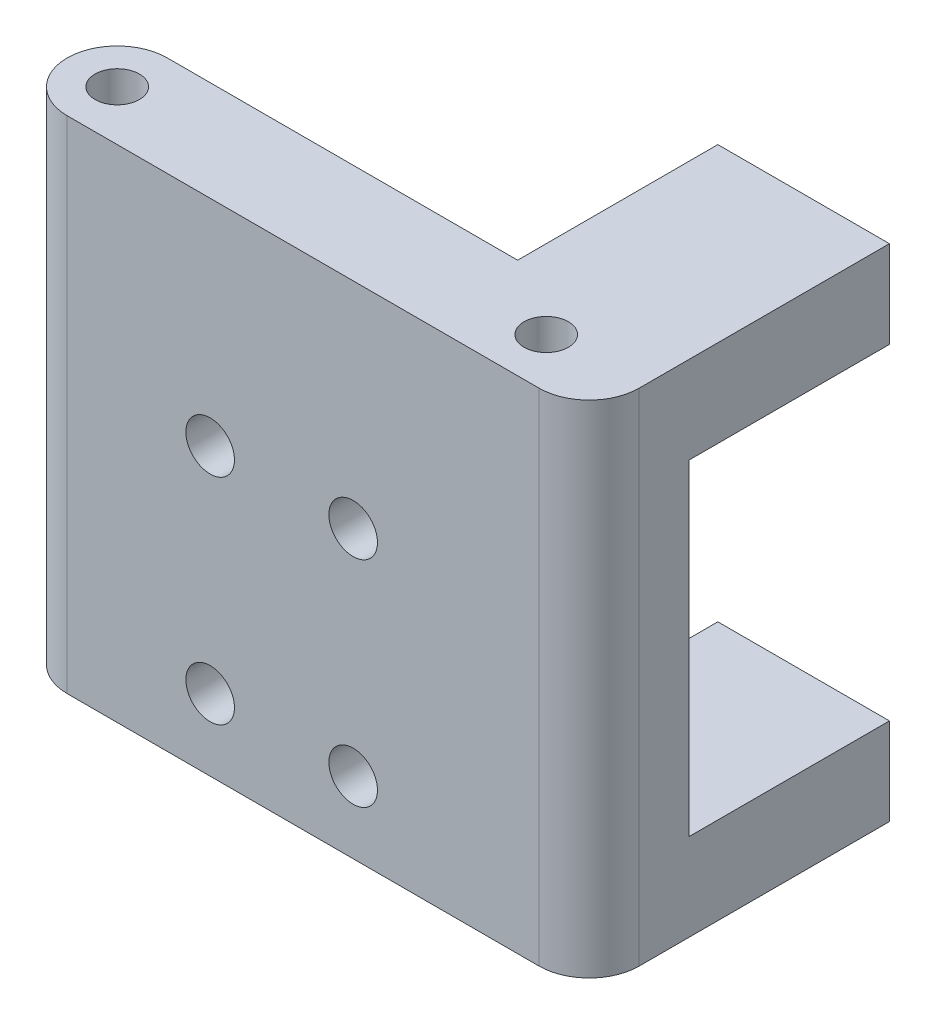
ISO-10303-21;
HEADER;
FILE_DESCRIPTION(('STEP AP214'),'2;1');
FILE_NAME('part.step','',(''),(''),'','','');
FILE_SCHEMA(('AUTOMOTIVE_DESIGN { 1 0 10303 214 1 1 1 1 }'));
ENDSEC;
DATA;
#1=APPLICATION_CONTEXT('core data for automotive mechanical design processes');
#2=APPLICATION_PROTOCOL_DEFINITION('international standard','automotive_design',2000,#1);
#3=PRODUCT_CONTEXT('',#1,'mechanical');
#4=PRODUCT('Part','Part','',(#3));
#5=PRODUCT_RELATED_PRODUCT_CATEGORY('part','',(#4));
#6=PRODUCT_DEFINITION_FORMATION('','',#4);
#7=PRODUCT_DEFINITION_CONTEXT('part definition',#1,'design');
#8=PRODUCT_DEFINITION('design','',#6,#7);
#9=PRODUCT_DEFINITION_SHAPE('','',#8);
#10=(LENGTH_UNIT() NAMED_UNIT(*) SI_UNIT(.MILLI.,.METRE.));
#11=(NAMED_UNIT(*) PLANE_ANGLE_UNIT() SI_UNIT($,.RADIAN.));
#12=(NAMED_UNIT(*) SI_UNIT($,.STERADIAN.) SOLID_ANGLE_UNIT());
#13=UNCERTAINTY_MEASURE_WITH_UNIT(LENGTH_MEASURE(1.E-05),#10,'distance_accuracy_value','');
#14=(GEOMETRIC_REPRESENTATION_CONTEXT(3) GLOBAL_UNCERTAINTY_ASSIGNED_CONTEXT((#13)) GLOBAL_UNIT_ASSIGNED_CONTEXT((#10,
#11,#12)) REPRESENTATION_CONTEXT('',''));
#15=CARTESIAN_POINT('',(0.,0.,0.));
#16=DIRECTION('',(0.,0.,1.));
#17=DIRECTION('',(1.,0.,0.));
#18=AXIS2_PLACEMENT_3D('',#15,#16,#17);
#19=CARTESIAN_POINT('',(-18.5,35.,-3.5));
#20=DIRECTION('',(0.,0.,-1.));
#21=DIRECTION('',(-1.,0.,0.));
#22=AXIS2_PLACEMENT_3D('',#19,#20,#21);
#23=PLANE('',#22);
#24=CARTESIAN_POINT('',(5.,20.,-3.5));
#25=DIRECTION('',(0.,0.,-1.));
#26=DIRECTION('',(-1.,0.,0.));
#27=AXIS2_PLACEMENT_3D('',#24,#25,#26);
#28=CIRCLE('',#27,3.15);
#29=CARTESIAN_POINT('',(1.85,20.,-3.5));
#30=VERTEX_POINT('',#29);
#31=EDGE_CURVE('E256',#30,#30,#28,.T.);
#32=ORIENTED_EDGE('',*,*,#31,.F.);
#33=EDGE_LOOP('',(#32));
#34=FACE_BOUND('',#33,.T.);
#35=CARTESIAN_POINT('',(-5.,20.,-3.5));
#36=DIRECTION('',(0.,0.,-1.));
#37=DIRECTION('',(-1.,0.,0.));
#38=AXIS2_PLACEMENT_3D('',#35,#36,#37);
#39=CIRCLE('',#38,3.15);
#40=CARTESIAN_POINT('',(-8.15,20.,-3.5));
#41=VERTEX_POINT('',#40);
#42=EDGE_CURVE('E284',#41,#41,#39,.T.);
#43=ORIENTED_EDGE('',*,*,#42,.F.);
#44=EDGE_LOOP('',(#43));
#45=FACE_BOUND('',#44,.T.);
#46=CARTESIAN_POINT('',(-5.,5.,-3.5));
#47=DIRECTION('',(0.,0.,-1.));
#48=DIRECTION('',(-1.,0.,0.));
#49=AXIS2_PLACEMENT_3D('',#46,#47,#48);
#50=CIRCLE('',#49,3.15);
#51=CARTESIAN_POINT('',(-8.15,5.,-3.5));
#52=VERTEX_POINT('',#51);
#53=EDGE_CURVE('E293',#52,#52,#50,.T.);
#54=ORIENTED_EDGE('',*,*,#53,.F.);
#55=EDGE_LOOP('',(#54));
#56=FACE_BOUND('',#55,.T.);
#57=CARTESIAN_POINT('',(5.,5.,-3.5));
#58=DIRECTION('',(0.,0.,-1.));
#59=DIRECTION('',(-1.,0.,0.));
#60=AXIS2_PLACEMENT_3D('',#57,#58,#59);
#61=CIRCLE('',#60,3.15);
#62=CARTESIAN_POINT('',(1.85,5.,-3.5));
#63=VERTEX_POINT('',#62);
#64=EDGE_CURVE('E302',#63,#63,#61,.T.);
#65=ORIENTED_EDGE('',*,*,#64,.F.);
#66=EDGE_LOOP('',(#65));
#67=FACE_BOUND('',#66,.T.);
#68=DIRECTION('',(1.,0.,0.));
#69=VECTOR('',#68,1.);
#70=CARTESIAN_POINT('',(-18.5,0.,-3.5));
#71=LINE('',#70,#69);
#72=CARTESIAN_POINT('',(-15.,0.,-3.5));
#73=VERTEX_POINT('',#72);
#74=CARTESIAN_POINT('',(9.49999999999999,0.,-3.5));
#75=VERTEX_POINT('',#74);
#76=EDGE_CURVE('E205',#73,#75,#71,.T.);
#77=ORIENTED_EDGE('',*,*,#76,.F.);
#78=DIRECTION('',(0.,-1.,0.));
#79=VECTOR('',#78,1.);
#80=CARTESIAN_POINT('',(-15.,35.,-3.5));
#81=LINE('',#80,#79);
#82=CARTESIAN_POINT('',(-15.,35.,-3.5));
#83=VERTEX_POINT('',#82);
#84=EDGE_CURVE('E11',#73,#83,#81,.F.);
#85=ORIENTED_EDGE('',*,*,#84,.T.);
#86=DIRECTION('',(1.,0.,0.));
#87=VECTOR('',#86,1.);
#88=CARTESIAN_POINT('',(-18.5,35.,-3.5));
#89=LINE('',#88,#87);
#90=CARTESIAN_POINT('',(9.49999999999999,35.,-3.5));
#91=VERTEX_POINT('',#90);
#92=EDGE_CURVE('E207',#83,#91,#89,.T.);
#93=ORIENTED_EDGE('',*,*,#92,.T.);
#94=DIRECTION('',(0.,-1.,0.));
#95=VECTOR('',#94,1.);
#96=CARTESIAN_POINT('',(9.49999999999999,0.,-3.5));
#97=LINE('',#96,#95);
#98=CARTESIAN_POINT('',(9.49999999999999,28.9,-3.5));
#99=VERTEX_POINT('',#98);
#100=EDGE_CURVE('E174',#91,#99,#97,.T.);
#101=ORIENTED_EDGE('',*,*,#100,.T.);
#102=DIRECTION('',(-1.,0.,0.));
#103=VECTOR('',#102,1.);
#104=CARTESIAN_POINT('',(0.,28.9,-3.5));
#105=LINE('',#104,#103);
#106=CARTESIAN_POINT('',(21.5,28.9,-3.5));
#107=VERTEX_POINT('',#106);
#108=EDGE_CURVE('E188',#107,#99,#105,.T.);
#109=ORIENTED_EDGE('',*,*,#108,.F.);
#110=DIRECTION('',(0.,-1.,0.));
#111=VECTOR('',#110,1.);
#112=CARTESIAN_POINT('',(21.5,35.,-3.5));
#113=LINE('',#112,#111);
#114=CARTESIAN_POINT('',(21.5,6.1,-3.5));
#115=VERTEX_POINT('',#114);
#116=EDGE_CURVE('E209',#107,#115,#113,.T.);
#117=ORIENTED_EDGE('',*,*,#116,.T.);
#118=DIRECTION('',(-1.,0.,0.));
#119=VECTOR('',#118,1.);
#120=CARTESIAN_POINT('',(0.,6.1,-3.5));
#121=LINE('',#120,#119);
#122=CARTESIAN_POINT('',(9.49999999999999,6.1,-3.5));
#123=VERTEX_POINT('',#122);
#124=EDGE_CURVE('E132',#115,#123,#121,.T.);
#125=ORIENTED_EDGE('',*,*,#124,.T.);
#126=DIRECTION('',(0.,-1.,0.));
#127=VECTOR('',#126,1.);
#128=CARTESIAN_POINT('',(9.49999999999999,0.,-3.5));
#129=LINE('',#128,#127);
#130=EDGE_CURVE('E156',#123,#75,#129,.T.);
#131=ORIENTED_EDGE('',*,*,#130,.T.);
#132=EDGE_LOOP('',(#77,#85,#93,#101,#109,#117,#125,#131));
#133=FACE_BOUND('',#132,.T.);
#134=ADVANCED_FACE('F36',(#34,#45,#56,#67,#133),#23,.T.);
#135=CARTESIAN_POINT('',(-18.5,35.,3.5));
#136=DIRECTION('',(0.,0.,-1.));
#137=DIRECTION('',(-1.,0.,0.));
#138=AXIS2_PLACEMENT_3D('',#135,#136,#137);
#139=PLANE('',#138);
#140=CARTESIAN_POINT('',(5.,20.,3.5));
#141=DIRECTION('',(0.,0.,-1.));
#142=DIRECTION('',(-1.,0.,0.));
#143=AXIS2_PLACEMENT_3D('',#140,#141,#142);
#144=CIRCLE('',#143,1.7);
#145=CARTESIAN_POINT('',(3.3,20.,3.5));
#146=VERTEX_POINT('',#145);
#147=EDGE_CURVE('E281',#146,#146,#144,.T.);
#148=ORIENTED_EDGE('',*,*,#147,.T.);
#149=EDGE_LOOP('',(#148));
#150=FACE_BOUND('',#149,.T.);
#151=CARTESIAN_POINT('',(-5.,20.,3.5));
#152=DIRECTION('',(0.,0.,-1.));
#153=DIRECTION('',(-1.,0.,0.));
#154=AXIS2_PLACEMENT_3D('',#151,#152,#153);
#155=CIRCLE('',#154,1.7);
#156=CARTESIAN_POINT('',(-6.7,20.,3.5));
#157=VERTEX_POINT('',#156);
#158=EDGE_CURVE('E290',#157,#157,#155,.T.);
#159=ORIENTED_EDGE('',*,*,#158,.T.);
#160=EDGE_LOOP('',(#159));
#161=FACE_BOUND('',#160,.T.);
#162=CARTESIAN_POINT('',(-5.,5.,3.5));
#163=DIRECTION('',(0.,0.,-1.));
#164=DIRECTION('',(-1.,0.,0.));
#165=AXIS2_PLACEMENT_3D('',#162,#163,#164);
#166=CIRCLE('',#165,1.7);
#167=CARTESIAN_POINT('',(-6.7,5.,3.5));
#168=VERTEX_POINT('',#167);
#169=EDGE_CURVE('E299',#168,#168,#166,.T.);
#170=ORIENTED_EDGE('',*,*,#169,.T.);
#171=EDGE_LOOP('',(#170));
#172=FACE_BOUND('',#171,.T.);
#173=CARTESIAN_POINT('',(5.,5.,3.5));
#174=DIRECTION('',(0.,0.,-1.));
#175=DIRECTION('',(-1.,0.,0.));
#176=AXIS2_PLACEMENT_3D('',#173,#174,#175);
#177=CIRCLE('',#176,1.7);
#178=CARTESIAN_POINT('',(3.3,5.,3.5));
#179=VERTEX_POINT('',#178);
#180=EDGE_CURVE('E164',#179,#179,#177,.T.);
#181=ORIENTED_EDGE('',*,*,#180,.T.);
#182=EDGE_LOOP('',(#181));
#183=FACE_BOUND('',#182,.T.);
#184=DIRECTION('',(1.,0.,0.));
#185=VECTOR('',#184,1.);
#186=CARTESIAN_POINT('',(-18.5,0.,3.5));
#187=LINE('',#186,#185);
#188=CARTESIAN_POINT('',(-15.,0.,3.5));
#189=VERTEX_POINT('',#188);
#190=CARTESIAN_POINT('',(18.,0.,3.5));
#191=VERTEX_POINT('',#190);
#192=EDGE_CURVE('E200',#189,#191,#187,.T.);
#193=ORIENTED_EDGE('',*,*,#192,.T.);
#194=DIRECTION('',(0.,-1.,0.));
#195=VECTOR('',#194,1.);
#196=CARTESIAN_POINT('',(18.,35.,3.5));
#197=LINE('',#196,#195);
#198=CARTESIAN_POINT('',(18.,35.,3.5));
#199=VERTEX_POINT('',#198);
#200=EDGE_CURVE('E229',#191,#199,#197,.F.);
#201=ORIENTED_EDGE('',*,*,#200,.T.);
#202=DIRECTION('',(1.,0.,0.));
#203=VECTOR('',#202,1.);
#204=CARTESIAN_POINT('',(-18.5,35.,3.5));
#205=LINE('',#204,#203);
#206=CARTESIAN_POINT('',(-15.,35.,3.5));
#207=VERTEX_POINT('',#206);
#208=EDGE_CURVE('E201',#207,#199,#205,.T.);
#209=ORIENTED_EDGE('',*,*,#208,.F.);
#210=DIRECTION('',(0.,-1.,0.));
#211=VECTOR('',#210,1.);
#212=CARTESIAN_POINT('',(-15.,35.,3.5));
#213=LINE('',#212,#211);
#214=EDGE_CURVE('E226',#207,#189,#213,.T.);
#215=ORIENTED_EDGE('',*,*,#214,.T.);
#216=EDGE_LOOP('',(#193,#201,#209,#215));
#217=FACE_BOUND('',#216,.T.);
#218=ADVANCED_FACE('F248',(#150,#161,#172,#183,#217),#139,.F.);
#219=CARTESIAN_POINT('',(21.5,35.,-3.5));
#220=DIRECTION('',(1.,0.,0.));
#221=DIRECTION('',(0.,0.,-1.));
#222=AXIS2_PLACEMENT_3D('',#219,#220,#221);
#223=PLANE('',#222);
#224=DIRECTION('',(0.,0.,1.));
#225=VECTOR('',#224,1.);
#226=CARTESIAN_POINT('',(21.5,35.,-3.5));
#227=LINE('',#226,#225);
#228=CARTESIAN_POINT('',(21.5,35.,-17.5));
#229=VERTEX_POINT('',#228);
#230=CARTESIAN_POINT('',(21.5,35.,0.));
#231=VERTEX_POINT('',#230);
#232=EDGE_CURVE('E204',#229,#231,#227,.T.);
#233=ORIENTED_EDGE('',*,*,#232,.T.);
#234=DIRECTION('',(0.,-1.,0.));
#235=VECTOR('',#234,1.);
#236=CARTESIAN_POINT('',(21.5,0.,0.));
#237=LINE('',#236,#235);
#238=CARTESIAN_POINT('',(21.5,0.,0.));
#239=VERTEX_POINT('',#238);
#240=EDGE_CURVE('E218',#231,#239,#237,.T.);
#241=ORIENTED_EDGE('',*,*,#240,.T.);
#242=DIRECTION('',(0.,0.,1.));
#243=VECTOR('',#242,1.);
#244=CARTESIAN_POINT('',(21.5,0.,-3.5));
#245=LINE('',#244,#243);
#246=CARTESIAN_POINT('',(21.5,0.,-17.5));
#247=VERTEX_POINT('',#246);
#248=EDGE_CURVE('E145',#247,#239,#245,.T.);
#249=ORIENTED_EDGE('',*,*,#248,.F.);
#250=DIRECTION('',(0.,-1.,0.));
#251=VECTOR('',#250,1.);
#252=CARTESIAN_POINT('',(21.5,0.,-17.5));
#253=LINE('',#252,#251);
#254=CARTESIAN_POINT('',(21.5,6.1,-17.5));
#255=VERTEX_POINT('',#254);
#256=EDGE_CURVE('E140',#255,#247,#253,.T.);
#257=ORIENTED_EDGE('',*,*,#256,.F.);
#258=DIRECTION('',(0.,0.,1.));
#259=VECTOR('',#258,1.);
#260=CARTESIAN_POINT('',(21.5,6.1,-17.5));
#261=LINE('',#260,#259);
#262=EDGE_CURVE('E125',#255,#115,#261,.T.);
#263=ORIENTED_EDGE('',*,*,#262,.T.);
#264=ORIENTED_EDGE('',*,*,#116,.F.);
#265=DIRECTION('',(0.,0.,1.));
#266=VECTOR('',#265,1.);
#267=CARTESIAN_POINT('',(21.5,28.9,-17.5));
#268=LINE('',#267,#266);
#269=CARTESIAN_POINT('',(21.5,28.9,-17.5));
#270=VERTEX_POINT('',#269);
#271=EDGE_CURVE('E197',#270,#107,#268,.T.);
#272=ORIENTED_EDGE('',*,*,#271,.F.);
#273=DIRECTION('',(0.,-1.,0.));
#274=VECTOR('',#273,1.);
#275=CARTESIAN_POINT('',(21.5,0.,-17.5));
#276=LINE('',#275,#274);
#277=EDGE_CURVE('E173',#229,#270,#276,.T.);
#278=ORIENTED_EDGE('',*,*,#277,.F.);
#279=EDGE_LOOP('',(#233,#241,#249,#257,#263,#264,#272,#278));
#280=FACE_BOUND('',#279,.T.);
#281=ADVANCED_FACE('F142',(#280),#223,.T.);
#282=CARTESIAN_POINT('',(0.,35.,0.));
#283=DIRECTION('',(0.,-1.,0.));
#284=DIRECTION('',(0.,0.,-1.));
#285=AXIS2_PLACEMENT_3D('',#282,#283,#284);
#286=PLANE('',#285);
#287=CARTESIAN_POINT('',(15.,35.,0.));
#288=DIRECTION('',(0.,1.,0.));
#289=DIRECTION('',(0.,0.,1.));
#290=AXIS2_PLACEMENT_3D('',#287,#288,#289);
#291=CIRCLE('',#290,1.55);
#292=CARTESIAN_POINT('',(15.,35.,1.55));
#293=VERTEX_POINT('',#292);
#294=EDGE_CURVE('E257',#293,#293,#291,.T.);
#295=ORIENTED_EDGE('',*,*,#294,.F.);
#296=EDGE_LOOP('',(#295));
#297=FACE_BOUND('',#296,.T.);
#298=CARTESIAN_POINT('',(-15.,35.,0.));
#299=DIRECTION('',(0.,1.,0.));
#300=DIRECTION('',(0.,0.,1.));
#301=AXIS2_PLACEMENT_3D('',#298,#299,#300);
#302=CIRCLE('',#301,1.55);
#303=CARTESIAN_POINT('',(-15.,35.,1.55));
#304=VERTEX_POINT('',#303);
#305=EDGE_CURVE('E267',#304,#304,#302,.T.);
#306=ORIENTED_EDGE('',*,*,#305,.F.);
#307=EDGE_LOOP('',(#306));
#308=FACE_BOUND('',#307,.T.);
#309=ORIENTED_EDGE('',*,*,#208,.T.);
#310=CARTESIAN_POINT('',(18.,35.,0.));
#311=DIRECTION('',(0.,-1.,0.));
#312=DIRECTION('',(0.,0.,-1.));
#313=AXIS2_PLACEMENT_3D('',#310,#311,#312);
#314=CIRCLE('',#313,3.5);
#315=EDGE_CURVE('E45',#199,#231,#314,.F.);
#316=ORIENTED_EDGE('',*,*,#315,.T.);
#317=ORIENTED_EDGE('',*,*,#232,.F.);
#318=DIRECTION('',(1.,0.,0.));
#319=VECTOR('',#318,1.);
#320=CARTESIAN_POINT('',(0.,35.,-17.5));
#321=LINE('',#320,#319);
#322=CARTESIAN_POINT('',(9.49999999999999,35.,-17.5));
#323=VERTEX_POINT('',#322);
#324=EDGE_CURVE('E182',#323,#229,#321,.T.);
#325=ORIENTED_EDGE('',*,*,#324,.F.);
#326=DIRECTION('',(0.,0.,1.));
#327=VECTOR('',#326,1.);
#328=CARTESIAN_POINT('',(9.49999999999999,35.,-17.5));
#329=LINE('',#328,#327);
#330=EDGE_CURVE('E185',#323,#91,#329,.T.);
#331=ORIENTED_EDGE('',*,*,#330,.T.);
#332=ORIENTED_EDGE('',*,*,#92,.F.);
#333=CARTESIAN_POINT('',(-15.,35.,0.));
#334=DIRECTION('',(0.,-1.,0.));
#335=DIRECTION('',(0.,0.,-1.));
#336=AXIS2_PLACEMENT_3D('',#333,#334,#335);
#337=CIRCLE('',#336,3.5);
#338=CARTESIAN_POINT('',(-18.5,35.,0.));
#339=VERTEX_POINT('',#338);
#340=EDGE_CURVE('E52',#83,#339,#337,.F.);
#341=ORIENTED_EDGE('',*,*,#340,.T.);
#342=CARTESIAN_POINT('',(-15.,35.,0.));
#343=DIRECTION('',(0.,-1.,0.));
#344=DIRECTION('',(0.,0.,-1.));
#345=AXIS2_PLACEMENT_3D('',#342,#343,#344);
#346=CIRCLE('',#345,3.5);
#347=EDGE_CURVE('E232',#339,#207,#346,.F.);
#348=ORIENTED_EDGE('',*,*,#347,.T.);
#349=EDGE_LOOP('',(#309,#316,#317,#325,#331,#332,#341,#348));
#350=FACE_BOUND('',#349,.T.);
#351=ADVANCED_FACE('F235',(#297,#308,#350),#286,.F.);
#352=CARTESIAN_POINT('',(0.,0.,0.));
#353=DIRECTION('',(0.,-1.,0.));
#354=DIRECTION('',(0.,0.,-1.));
#355=AXIS2_PLACEMENT_3D('',#352,#353,#354);
#356=PLANE('',#355);
#357=CARTESIAN_POINT('',(0.,0.,0.));
#358=DIRECTION('',(0.,1.,0.));
#359=DIRECTION('',(0.,0.,1.));
#360=AXIS2_PLACEMENT_3D('',#357,#358,#359);
#361=CIRCLE('',#360,2.4);
#362=CARTESIAN_POINT('',(0.,0.,2.4));
#363=VERTEX_POINT('',#362);
#364=EDGE_CURVE('E270',#363,#363,#361,.T.);
#365=ORIENTED_EDGE('',*,*,#364,.T.);
#366=EDGE_LOOP('',(#365));
#367=FACE_BOUND('',#366,.T.);
#368=CARTESIAN_POINT('',(15.,0.,0.));
#369=DIRECTION('',(0.,1.,0.));
#370=DIRECTION('',(0.,0.,1.));
#371=AXIS2_PLACEMENT_3D('',#368,#369,#370);
#372=CIRCLE('',#371,1.55);
#373=CARTESIAN_POINT('',(15.,0.,1.55));
#374=VERTEX_POINT('',#373);
#375=EDGE_CURVE('E262',#374,#374,#372,.T.);
#376=ORIENTED_EDGE('',*,*,#375,.T.);
#377=EDGE_LOOP('',(#376));
#378=FACE_BOUND('',#377,.T.);
#379=CARTESIAN_POINT('',(-15.,0.,0.));
#380=DIRECTION('',(0.,1.,0.));
#381=DIRECTION('',(0.,0.,1.));
#382=AXIS2_PLACEMENT_3D('',#379,#380,#381);
#383=CIRCLE('',#382,1.55);
#384=CARTESIAN_POINT('',(-15.,0.,1.55));
#385=VERTEX_POINT('',#384);
#386=EDGE_CURVE('E275',#385,#385,#383,.T.);
#387=ORIENTED_EDGE('',*,*,#386,.T.);
#388=EDGE_LOOP('',(#387));
#389=FACE_BOUND('',#388,.T.);
#390=ORIENTED_EDGE('',*,*,#248,.T.);
#391=CARTESIAN_POINT('',(18.,0.,0.));
#392=DIRECTION('',(0.,-1.,0.));
#393=DIRECTION('',(0.,0.,-1.));
#394=AXIS2_PLACEMENT_3D('',#391,#392,#393);
#395=CIRCLE('',#394,3.5);
#396=EDGE_CURVE('E224',#239,#191,#395,.T.);
#397=ORIENTED_EDGE('',*,*,#396,.T.);
#398=ORIENTED_EDGE('',*,*,#192,.F.);
#399=CARTESIAN_POINT('',(-15.,0.,0.));
#400=DIRECTION('',(0.,-1.,0.));
#401=DIRECTION('',(0.,0.,-1.));
#402=AXIS2_PLACEMENT_3D('',#399,#400,#401);
#403=CIRCLE('',#402,3.5);
#404=CARTESIAN_POINT('',(-18.5,0.,0.));
#405=VERTEX_POINT('',#404);
#406=EDGE_CURVE('E222',#189,#405,#403,.T.);
#407=ORIENTED_EDGE('',*,*,#406,.T.);
#408=CARTESIAN_POINT('',(-15.,0.,0.));
#409=DIRECTION('',(0.,-1.,0.));
#410=DIRECTION('',(0.,0.,-1.));
#411=AXIS2_PLACEMENT_3D('',#408,#409,#410);
#412=CIRCLE('',#411,3.5);
#413=EDGE_CURVE('E220',#405,#73,#412,.T.);
#414=ORIENTED_EDGE('',*,*,#413,.T.);
#415=ORIENTED_EDGE('',*,*,#76,.T.);
#416=DIRECTION('',(0.,0.,1.));
#417=VECTOR('',#416,1.);
#418=CARTESIAN_POINT('',(9.49999999999999,0.,-17.5));
#419=LINE('',#418,#417);
#420=CARTESIAN_POINT('',(9.49999999999999,0.,-17.5));
#421=VERTEX_POINT('',#420);
#422=EDGE_CURVE('E137',#421,#75,#419,.T.);
#423=ORIENTED_EDGE('',*,*,#422,.F.);
#424=DIRECTION('',(-1.,0.,0.));
#425=VECTOR('',#424,1.);
#426=CARTESIAN_POINT('',(0.,0.,-17.5));
#427=LINE('',#426,#425);
#428=EDGE_CURVE('E148',#247,#421,#427,.T.);
#429=ORIENTED_EDGE('',*,*,#428,.F.);
#430=EDGE_LOOP('',(#390,#397,#398,#407,#414,#415,#423,#429));
#431=FACE_BOUND('',#430,.T.);
#432=ADVANCED_FACE('F246',(#367,#378,#389,#431),#356,.T.);
#433=CARTESIAN_POINT('',(0.,28.9,-17.5));
#434=DIRECTION('',(0.,1.,0.));
#435=DIRECTION('',(0.,0.,1.));
#436=AXIS2_PLACEMENT_3D('',#433,#434,#435);
#437=PLANE('',#436);
#438=ORIENTED_EDGE('',*,*,#108,.T.);
#439=DIRECTION('',(0.,0.,1.));
#440=VECTOR('',#439,1.);
#441=CARTESIAN_POINT('',(9.49999999999999,28.9,-17.5));
#442=LINE('',#441,#440);
#443=CARTESIAN_POINT('',(9.49999999999999,28.9,-17.5));
#444=VERTEX_POINT('',#443);
#445=EDGE_CURVE('E194',#444,#99,#442,.T.);
#446=ORIENTED_EDGE('',*,*,#445,.F.);
#447=DIRECTION('',(-1.,0.,0.));
#448=VECTOR('',#447,1.);
#449=CARTESIAN_POINT('',(0.,28.9,-17.5));
#450=LINE('',#449,#448);
#451=EDGE_CURVE('E177',#270,#444,#450,.T.);
#452=ORIENTED_EDGE('',*,*,#451,.F.);
#453=ORIENTED_EDGE('',*,*,#271,.T.);
#454=EDGE_LOOP('',(#438,#446,#452,#453));
#455=FACE_BOUND('',#454,.T.);
#456=ADVANCED_FACE('F334',(#455),#437,.F.);
#457=CARTESIAN_POINT('',(9.49999999999999,0.,-17.5));
#458=DIRECTION('',(-1.,0.,0.));
#459=DIRECTION('',(0.,-1.,0.));
#460=AXIS2_PLACEMENT_3D('',#457,#458,#459);
#461=PLANE('',#460);
#462=ORIENTED_EDGE('',*,*,#100,.F.);
#463=ORIENTED_EDGE('',*,*,#330,.F.);
#464=DIRECTION('',(0.,-1.,0.));
#465=VECTOR('',#464,1.);
#466=CARTESIAN_POINT('',(9.49999999999999,0.,-17.5));
#467=LINE('',#466,#465);
#468=EDGE_CURVE('E179',#323,#444,#467,.T.);
#469=ORIENTED_EDGE('',*,*,#468,.T.);
#470=ORIENTED_EDGE('',*,*,#445,.T.);
#471=EDGE_LOOP('',(#462,#463,#469,#470));
#472=FACE_BOUND('',#471,.T.);
#473=ADVANCED_FACE('F341',(#472),#461,.T.);
#474=CARTESIAN_POINT('',(15.5,31.75,-17.5));
#475=DIRECTION('',(0.,0.,1.));
#476=DIRECTION('',(1.,0.,0.));
#477=AXIS2_PLACEMENT_3D('',#474,#475,#476);
#478=CYLINDRICAL_SURFACE('',#477,0.600000000000005);
#479=CARTESIAN_POINT('',(15.5,31.75,-17.5));
#480=DIRECTION('',(0.,0.,-1.));
#481=DIRECTION('',(-1.,0.,0.));
#482=AXIS2_PLACEMENT_3D('',#479,#480,#481);
#483=CIRCLE('',#482,0.600000000000005);
#484=CARTESIAN_POINT('',(14.9,31.75,-17.5));
#485=VERTEX_POINT('',#484);
#486=EDGE_CURVE('E170',#485,#485,#483,.T.);
#487=ORIENTED_EDGE('',*,*,#486,.T.);
#488=EDGE_LOOP('',(#487));
#489=FACE_BOUND('',#488,.T.);
#490=CARTESIAN_POINT('',(15.5,31.75,-3.5));
#491=DIRECTION('',(0.,0.,-1.));
#492=DIRECTION('',(-1.,0.,0.));
#493=AXIS2_PLACEMENT_3D('',#490,#491,#492);
#494=CIRCLE('',#493,0.600000000000005);
#495=CARTESIAN_POINT('',(14.9,31.75,-3.5));
#496=VERTEX_POINT('',#495);
#497=EDGE_CURVE('E136',#496,#496,#494,.T.);
#498=ORIENTED_EDGE('',*,*,#497,.F.);
#499=EDGE_LOOP('',(#498));
#500=FACE_BOUND('',#499,.T.);
#501=ADVANCED_FACE('F343',(#489,#500),#478,.F.);
#502=CARTESIAN_POINT('',(0.,0.,-17.5));
#503=DIRECTION('',(0.,0.,-1.));
#504=DIRECTION('',(-1.,0.,0.));
#505=AXIS2_PLACEMENT_3D('',#502,#503,#504);
#506=PLANE('',#505);
#507=ORIENTED_EDGE('',*,*,#486,.F.);
#508=EDGE_LOOP('',(#507));
#509=FACE_BOUND('',#508,.T.);
#510=ORIENTED_EDGE('',*,*,#277,.T.);
#511=ORIENTED_EDGE('',*,*,#451,.T.);
#512=ORIENTED_EDGE('',*,*,#468,.F.);
#513=ORIENTED_EDGE('',*,*,#324,.T.);
#514=EDGE_LOOP('',(#510,#511,#512,#513));
#515=FACE_BOUND('',#514,.T.);
#516=ADVANCED_FACE('F338',(#509,#515),#506,.T.);
#517=ORIENTED_EDGE('',*,*,#497,.T.);
#518=EDGE_LOOP('',(#517));
#519=FACE_BOUND('',#518,.T.);
#520=ADVANCED_FACE('F328',(#519),#23,.T.);
#521=CARTESIAN_POINT('',(0.,6.1,-17.5));
#522=DIRECTION('',(0.,1.,0.));
#523=DIRECTION('',(0.,0.,1.));
#524=AXIS2_PLACEMENT_3D('',#521,#522,#523);
#525=PLANE('',#524);
#526=ORIENTED_EDGE('',*,*,#124,.F.);
#527=ORIENTED_EDGE('',*,*,#262,.F.);
#528=DIRECTION('',(-1.,0.,0.));
#529=VECTOR('',#528,1.);
#530=CARTESIAN_POINT('',(0.,6.1,-17.5));
#531=LINE('',#530,#529);
#532=CARTESIAN_POINT('',(9.49999999999999,6.1,-17.5));
#533=VERTEX_POINT('',#532);
#534=EDGE_CURVE('E129',#255,#533,#531,.T.);
#535=ORIENTED_EDGE('',*,*,#534,.T.);
#536=DIRECTION('',(0.,0.,1.));
#537=VECTOR('',#536,1.);
#538=CARTESIAN_POINT('',(9.49999999999999,6.1,-17.5));
#539=LINE('',#538,#537);
#540=EDGE_CURVE('E162',#533,#123,#539,.T.);
#541=ORIENTED_EDGE('',*,*,#540,.T.);
#542=EDGE_LOOP('',(#526,#527,#535,#541));
#543=FACE_BOUND('',#542,.T.);
#544=ADVANCED_FACE('F127',(#543),#525,.T.);
#545=CARTESIAN_POINT('',(15.5,3.25,-17.5));
#546=DIRECTION('',(0.,0.,1.));
#547=DIRECTION('',(1.,0.,0.));
#548=AXIS2_PLACEMENT_3D('',#545,#546,#547);
#549=CYLINDRICAL_SURFACE('',#548,0.6);
#550=CARTESIAN_POINT('',(15.5,3.25,-17.5));
#551=DIRECTION('',(0.,0.,-1.));
#552=DIRECTION('',(-1.,0.,0.));
#553=AXIS2_PLACEMENT_3D('',#550,#551,#552);
#554=CIRCLE('',#553,0.6);
#555=CARTESIAN_POINT('',(14.9,3.25,-17.5));
#556=VERTEX_POINT('',#555);
#557=EDGE_CURVE('E153',#556,#556,#554,.T.);
#558=ORIENTED_EDGE('',*,*,#557,.T.);
#559=EDGE_LOOP('',(#558));
#560=FACE_BOUND('',#559,.T.);
#561=CARTESIAN_POINT('',(15.5,3.25,-3.5));
#562=DIRECTION('',(0.,0.,-1.));
#563=DIRECTION('',(-1.,0.,0.));
#564=AXIS2_PLACEMENT_3D('',#561,#562,#563);
#565=CIRCLE('',#564,0.6);
#566=CARTESIAN_POINT('',(14.9,3.25,-3.5));
#567=VERTEX_POINT('',#566);
#568=EDGE_CURVE('E215',#567,#567,#565,.F.);
#569=ORIENTED_EDGE('',*,*,#568,.T.);
#570=EDGE_LOOP('',(#569));
#571=FACE_BOUND('',#570,.T.);
#572=ADVANCED_FACE('F460',(#560,#571),#549,.F.);
#573=CARTESIAN_POINT('',(9.49999999999999,0.,-17.5));
#574=DIRECTION('',(-1.,0.,0.));
#575=DIRECTION('',(0.,-1.,0.));
#576=AXIS2_PLACEMENT_3D('',#573,#574,#575);
#577=PLANE('',#576);
#578=ORIENTED_EDGE('',*,*,#130,.F.);
#579=ORIENTED_EDGE('',*,*,#540,.F.);
#580=DIRECTION('',(0.,-1.,0.));
#581=VECTOR('',#580,1.);
#582=CARTESIAN_POINT('',(9.49999999999999,0.,-17.5));
#583=LINE('',#582,#581);
#584=EDGE_CURVE('E152',#533,#421,#583,.T.);
#585=ORIENTED_EDGE('',*,*,#584,.T.);
#586=ORIENTED_EDGE('',*,*,#422,.T.);
#587=EDGE_LOOP('',(#578,#579,#585,#586));
#588=FACE_BOUND('',#587,.T.);
#589=ADVANCED_FACE('F332',(#588),#577,.T.);
#590=CARTESIAN_POINT('',(0.,0.,-17.5));
#591=DIRECTION('',(0.,0.,-1.));
#592=DIRECTION('',(-1.,0.,0.));
#593=AXIS2_PLACEMENT_3D('',#590,#591,#592);
#594=PLANE('',#593);
#595=ORIENTED_EDGE('',*,*,#557,.F.);
#596=EDGE_LOOP('',(#595));
#597=FACE_BOUND('',#596,.T.);
#598=ORIENTED_EDGE('',*,*,#534,.F.);
#599=ORIENTED_EDGE('',*,*,#256,.T.);
#600=ORIENTED_EDGE('',*,*,#428,.T.);
#601=ORIENTED_EDGE('',*,*,#584,.F.);
#602=EDGE_LOOP('',(#598,#599,#600,#601));
#603=FACE_BOUND('',#602,.T.);
#604=ADVANCED_FACE('F150',(#597,#603),#594,.T.);
#605=ORIENTED_EDGE('',*,*,#568,.F.);
#606=EDGE_LOOP('',(#605));
#607=FACE_BOUND('',#606,.T.);
#608=ADVANCED_FACE('F315',(#607),#23,.T.);
#609=CARTESIAN_POINT('',(5.,5.,-3.5));
#610=DIRECTION('',(0.,0.,-1.));
#611=DIRECTION('',(-1.,0.,0.));
#612=AXIS2_PLACEMENT_3D('',#609,#610,#611);
#613=CYLINDRICAL_SURFACE('',#612,1.7);
#614=ORIENTED_EDGE('',*,*,#180,.F.);
#615=EDGE_LOOP('',(#614));
#616=FACE_BOUND('',#615,.T.);
#617=CARTESIAN_POINT('',(5.,5.,-2.05));
#618=DIRECTION('',(0.,0.,-1.));
#619=DIRECTION('',(-1.,0.,0.));
#620=AXIS2_PLACEMENT_3D('',#617,#618,#619);
#621=CIRCLE('',#620,1.7);
#622=CARTESIAN_POINT('',(3.3,5.,-2.05));
#623=VERTEX_POINT('',#622);
#624=EDGE_CURVE('E305',#623,#623,#621,.T.);
#625=ORIENTED_EDGE('',*,*,#624,.T.);
#626=EDGE_LOOP('',(#625));
#627=FACE_BOUND('',#626,.T.);
#628=ADVANCED_FACE('F311',(#616,#627),#613,.F.);
#629=CARTESIAN_POINT('',(5.,5.,-3.5));
#630=DIRECTION('',(0.,0.,-1.));
#631=DIRECTION('',(-1.,0.,0.));
#632=AXIS2_PLACEMENT_3D('',#629,#630,#631);
#633=CONICAL_SURFACE('',#632,3.15,0.785398163397448);
#634=ORIENTED_EDGE('',*,*,#624,.F.);
#635=EDGE_LOOP('',(#634));
#636=FACE_BOUND('',#635,.T.);
#637=ORIENTED_EDGE('',*,*,#64,.T.);
#638=EDGE_LOOP('',(#637));
#639=FACE_BOUND('',#638,.T.);
#640=ADVANCED_FACE('F314',(#636,#639),#633,.F.);
#641=CARTESIAN_POINT('',(-5.,5.,-3.5));
#642=DIRECTION('',(0.,0.,-1.));
#643=DIRECTION('',(-1.,0.,0.));
#644=AXIS2_PLACEMENT_3D('',#641,#642,#643);
#645=CYLINDRICAL_SURFACE('',#644,1.7);
#646=ORIENTED_EDGE('',*,*,#169,.F.);
#647=EDGE_LOOP('',(#646));
#648=FACE_BOUND('',#647,.T.);
#649=CARTESIAN_POINT('',(-5.,5.,-2.05));
#650=DIRECTION('',(0.,0.,-1.));
#651=DIRECTION('',(-1.,0.,0.));
#652=AXIS2_PLACEMENT_3D('',#649,#650,#651);
#653=CIRCLE('',#652,1.7);
#654=CARTESIAN_POINT('',(-6.7,5.,-2.05));
#655=VERTEX_POINT('',#654);
#656=EDGE_CURVE('E296',#655,#655,#653,.T.);
#657=ORIENTED_EDGE('',*,*,#656,.T.);
#658=EDGE_LOOP('',(#657));
#659=FACE_BOUND('',#658,.T.);
#660=ADVANCED_FACE('F321',(#648,#659),#645,.F.);
#661=CARTESIAN_POINT('',(-5.,5.,-3.5));
#662=DIRECTION('',(0.,0.,-1.));
#663=DIRECTION('',(-1.,0.,0.));
#664=AXIS2_PLACEMENT_3D('',#661,#662,#663);
#665=CONICAL_SURFACE('',#664,3.15,0.785398163397449);
#666=ORIENTED_EDGE('',*,*,#656,.F.);
#667=EDGE_LOOP('',(#666));
#668=FACE_BOUND('',#667,.T.);
#669=ORIENTED_EDGE('',*,*,#53,.T.);
#670=EDGE_LOOP('',(#669));
#671=FACE_BOUND('',#670,.T.);
#672=ADVANCED_FACE('F417',(#668,#671),#665,.F.);
#673=CARTESIAN_POINT('',(-5.,20.,-3.5));
#674=DIRECTION('',(0.,0.,-1.));
#675=DIRECTION('',(-1.,0.,0.));
#676=AXIS2_PLACEMENT_3D('',#673,#674,#675);
#677=CYLINDRICAL_SURFACE('',#676,1.7);
#678=ORIENTED_EDGE('',*,*,#158,.F.);
#679=EDGE_LOOP('',(#678));
#680=FACE_BOUND('',#679,.T.);
#681=CARTESIAN_POINT('',(-5.,20.,-2.05));
#682=DIRECTION('',(0.,0.,-1.));
#683=DIRECTION('',(-1.,0.,0.));
#684=AXIS2_PLACEMENT_3D('',#681,#682,#683);
#685=CIRCLE('',#684,1.7);
#686=CARTESIAN_POINT('',(-6.7,20.,-2.05));
#687=VERTEX_POINT('',#686);
#688=EDGE_CURVE('E287',#687,#687,#685,.T.);
#689=ORIENTED_EDGE('',*,*,#688,.T.);
#690=EDGE_LOOP('',(#689));
#691=FACE_BOUND('',#690,.T.);
#692=ADVANCED_FACE('F409',(#680,#691),#677,.F.);
#693=CARTESIAN_POINT('',(-5.,20.,-3.5));
#694=DIRECTION('',(0.,0.,-1.));
#695=DIRECTION('',(-1.,0.,0.));
#696=AXIS2_PLACEMENT_3D('',#693,#694,#695);
#697=CONICAL_SURFACE('',#696,3.15,0.785398163397449);
#698=ORIENTED_EDGE('',*,*,#688,.F.);
#699=EDGE_LOOP('',(#698));
#700=FACE_BOUND('',#699,.T.);
#701=ORIENTED_EDGE('',*,*,#42,.T.);
#702=EDGE_LOOP('',(#701));
#703=FACE_BOUND('',#702,.T.);
#704=ADVANCED_FACE('F401',(#700,#703),#697,.F.);
#705=CARTESIAN_POINT('',(5.,20.,-3.5));
#706=DIRECTION('',(0.,0.,-1.));
#707=DIRECTION('',(-1.,0.,0.));
#708=AXIS2_PLACEMENT_3D('',#705,#706,#707);
#709=CYLINDRICAL_SURFACE('',#708,1.7);
#710=ORIENTED_EDGE('',*,*,#147,.F.);
#711=EDGE_LOOP('',(#710));
#712=FACE_BOUND('',#711,.T.);
#713=CARTESIAN_POINT('',(5.,20.,-2.05));
#714=DIRECTION('',(0.,0.,-1.));
#715=DIRECTION('',(-1.,0.,0.));
#716=AXIS2_PLACEMENT_3D('',#713,#714,#715);
#717=CIRCLE('',#716,1.7);
#718=CARTESIAN_POINT('',(3.3,20.,-2.05));
#719=VERTEX_POINT('',#718);
#720=EDGE_CURVE('E259',#719,#719,#717,.T.);
#721=ORIENTED_EDGE('',*,*,#720,.T.);
#722=EDGE_LOOP('',(#721));
#723=FACE_BOUND('',#722,.T.);
#724=ADVANCED_FACE('F392',(#712,#723),#709,.F.);
#725=CARTESIAN_POINT('',(5.,20.,-3.5));
#726=DIRECTION('',(0.,0.,-1.));
#727=DIRECTION('',(-1.,0.,0.));
#728=AXIS2_PLACEMENT_3D('',#725,#726,#727);
#729=CONICAL_SURFACE('',#728,3.15,0.785398163397449);
#730=ORIENTED_EDGE('',*,*,#720,.F.);
#731=EDGE_LOOP('',(#730));
#732=FACE_BOUND('',#731,.T.);
#733=ORIENTED_EDGE('',*,*,#31,.T.);
#734=EDGE_LOOP('',(#733));
#735=FACE_BOUND('',#734,.T.);
#736=ADVANCED_FACE('F369',(#732,#735),#729,.F.);
#737=CARTESIAN_POINT('',(18.,35.,0.));
#738=DIRECTION('',(0.,1.,0.));
#739=DIRECTION('',(0.,0.,1.));
#740=AXIS2_PLACEMENT_3D('',#737,#738,#739);
#741=CYLINDRICAL_SURFACE('',#740,3.5);
#742=ORIENTED_EDGE('',*,*,#315,.F.);
#743=ORIENTED_EDGE('',*,*,#200,.F.);
#744=ORIENTED_EDGE('',*,*,#396,.F.);
#745=ORIENTED_EDGE('',*,*,#240,.F.);
#746=EDGE_LOOP('',(#742,#743,#744,#745));
#747=FACE_BOUND('',#746,.T.);
#748=ADVANCED_FACE('F243',(#747),#741,.T.);
#749=CARTESIAN_POINT('',(-15.,35.,0.));
#750=DIRECTION('',(0.,1.,0.));
#751=DIRECTION('',(0.,0.,1.));
#752=AXIS2_PLACEMENT_3D('',#749,#750,#751);
#753=CYLINDRICAL_SURFACE('',#752,3.5);
#754=DIRECTION('',(0.,-1.,0.));
#755=VECTOR('',#754,1.);
#756=CARTESIAN_POINT('',(-18.5,0.,0.));
#757=LINE('',#756,#755);
#758=EDGE_CURVE('E40',#339,#405,#757,.T.);
#759=ORIENTED_EDGE('',*,*,#758,.F.);
#760=ORIENTED_EDGE('',*,*,#340,.F.);
#761=ORIENTED_EDGE('',*,*,#84,.F.);
#762=ORIENTED_EDGE('',*,*,#413,.F.);
#763=EDGE_LOOP('',(#759,#760,#761,#762));
#764=FACE_BOUND('',#763,.T.);
#765=ADVANCED_FACE('F38',(#764),#753,.T.);
#766=CARTESIAN_POINT('',(-15.,35.,0.));
#767=DIRECTION('',(0.,-1.,0.));
#768=DIRECTION('',(0.,0.,-1.));
#769=AXIS2_PLACEMENT_3D('',#766,#767,#768);
#770=CYLINDRICAL_SURFACE('',#769,3.5);
#771=ORIENTED_EDGE('',*,*,#347,.F.);
#772=ORIENTED_EDGE('',*,*,#758,.T.);
#773=ORIENTED_EDGE('',*,*,#406,.F.);
#774=ORIENTED_EDGE('',*,*,#214,.F.);
#775=EDGE_LOOP('',(#771,#772,#773,#774));
#776=FACE_BOUND('',#775,.T.);
#777=ADVANCED_FACE('F252',(#776),#770,.T.);
#778=CARTESIAN_POINT('',(-15.,35.,0.));
#779=DIRECTION('',(0.,-1.,0.));
#780=DIRECTION('',(0.,0.,-1.));
#781=AXIS2_PLACEMENT_3D('',#778,#779,#780);
#782=CYLINDRICAL_SURFACE('',#781,1.55);
#783=ORIENTED_EDGE('',*,*,#305,.T.);
#784=EDGE_LOOP('',(#783));
#785=FACE_BOUND('',#784,.T.);
#786=ORIENTED_EDGE('',*,*,#386,.F.);
#787=EDGE_LOOP('',(#786));
#788=FACE_BOUND('',#787,.T.);
#789=ADVANCED_FACE('F371',(#785,#788),#782,.F.);
#790=CARTESIAN_POINT('',(15.,35.,0.));
#791=DIRECTION('',(0.,-1.,0.));
#792=DIRECTION('',(0.,0.,-1.));
#793=AXIS2_PLACEMENT_3D('',#790,#791,#792);
#794=CYLINDRICAL_SURFACE('',#793,1.55);
#795=ORIENTED_EDGE('',*,*,#294,.T.);
#796=EDGE_LOOP('',(#795));
#797=FACE_BOUND('',#796,.T.);
#798=ORIENTED_EDGE('',*,*,#375,.F.);
#799=EDGE_LOOP('',(#798));
#800=FACE_BOUND('',#799,.T.);
#801=ADVANCED_FACE('F376',(#797,#800),#794,.F.);
#802=CARTESIAN_POINT('',(0.,2.,0.));
#803=DIRECTION('',(0.,-1.,0.));
#804=DIRECTION('',(0.,0.,-1.));
#805=AXIS2_PLACEMENT_3D('',#802,#803,#804);
#806=CYLINDRICAL_SURFACE('',#805,2.4);
#807=CARTESIAN_POINT('',(0.,2.,0.));
#808=DIRECTION('',(0.,1.,0.));
#809=DIRECTION('',(0.,0.,1.));
#810=AXIS2_PLACEMENT_3D('',#807,#808,#809);
#811=CIRCLE('',#810,2.4);
#812=CARTESIAN_POINT('',(0.,2.,2.4));
#813=VERTEX_POINT('',#812);
#814=EDGE_CURVE('E277',#813,#813,#811,.T.);
#815=ORIENTED_EDGE('',*,*,#814,.T.);
#816=EDGE_LOOP('',(#815));
#817=FACE_BOUND('',#816,.T.);
#818=ORIENTED_EDGE('',*,*,#364,.F.);
#819=EDGE_LOOP('',(#818));
#820=FACE_BOUND('',#819,.T.);
#821=ADVANCED_FACE('F570',(#817,#820),#806,.F.);
#822=CARTESIAN_POINT('',(0.,2.,0.));
#823=DIRECTION('',(0.,1.,0.));
#824=DIRECTION('',(0.,0.,1.));
#825=AXIS2_PLACEMENT_3D('',#822,#823,#824);
#826=PLANE('',#825);
#827=ORIENTED_EDGE('',*,*,#814,.F.);
#828=EDGE_LOOP('',(#827));
#829=FACE_BOUND('',#828,.T.);
#830=ADVANCED_FACE('F579',(#829),#826,.F.);
#831=CLOSED_SHELL('',(#134,#218,#281,#351,#432,#456,#473,#501,#516,#520,#544,#572,#589,#604,
#608,#628,#640,#660,#672,#692,#704,#724,#736,#748,#765,#777,#789,#801,#821,#830));
#832=MANIFOLD_SOLID_BREP('B2',#831);
#833=ADVANCED_BREP_SHAPE_REPRESENTATION('',(#18,#832),#14);
#834=SHAPE_DEFINITION_REPRESENTATION(#9,#833);
ENDSEC;
END-ISO-10303-21;
